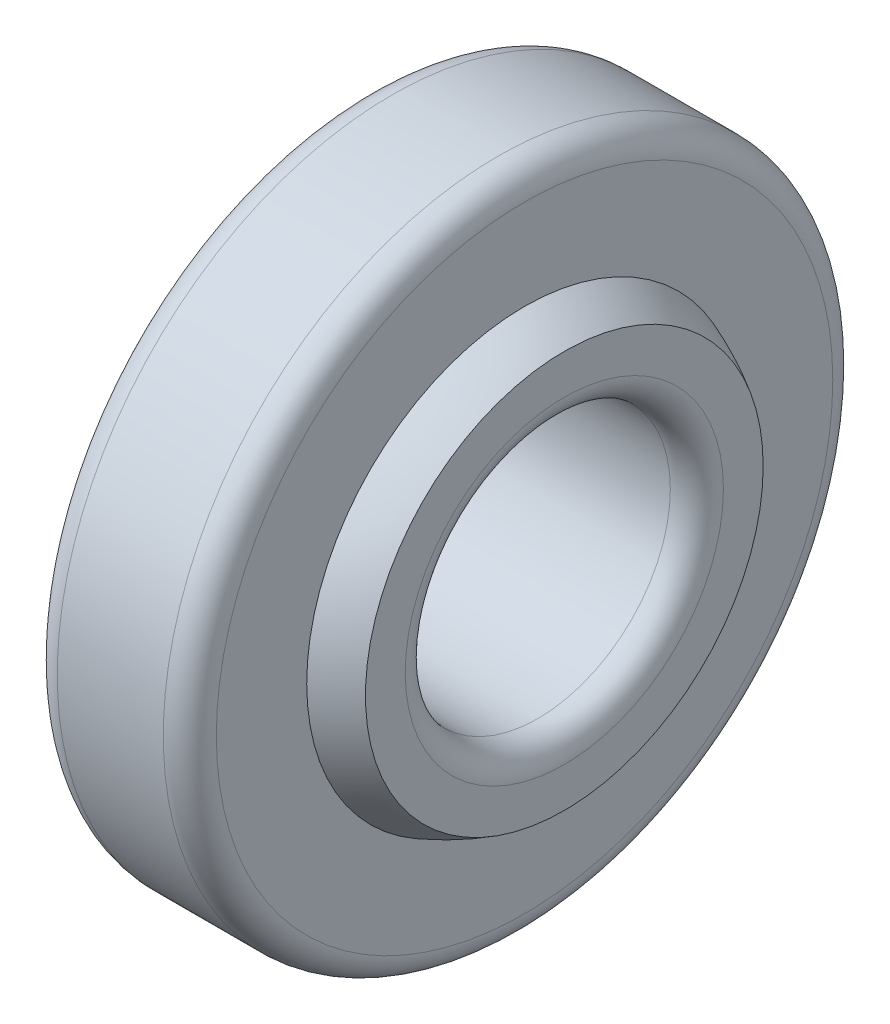
ISO-10303-21;
HEADER;
FILE_DESCRIPTION(('STEP AP214'),'2;1');
FILE_NAME('part.step','',(''),(''),'','','');
FILE_SCHEMA(('AUTOMOTIVE_DESIGN { 1 0 10303 214 1 1 1 1 }'));
ENDSEC;
DATA;
#1=APPLICATION_CONTEXT('core data for automotive mechanical design processes');
#2=APPLICATION_PROTOCOL_DEFINITION('international standard','automotive_design',2000,#1);
#3=PRODUCT_CONTEXT('',#1,'mechanical');
#4=PRODUCT('Part','Part','',(#3));
#5=PRODUCT_RELATED_PRODUCT_CATEGORY('part','',(#4));
#6=PRODUCT_DEFINITION_FORMATION('','',#4);
#7=PRODUCT_DEFINITION_CONTEXT('part definition',#1,'design');
#8=PRODUCT_DEFINITION('design','',#6,#7);
#9=PRODUCT_DEFINITION_SHAPE('','',#8);
#10=(LENGTH_UNIT() NAMED_UNIT(*) SI_UNIT(.MILLI.,.METRE.));
#11=(NAMED_UNIT(*) PLANE_ANGLE_UNIT() SI_UNIT($,.RADIAN.));
#12=(NAMED_UNIT(*) SI_UNIT($,.STERADIAN.) SOLID_ANGLE_UNIT());
#13=UNCERTAINTY_MEASURE_WITH_UNIT(LENGTH_MEASURE(1.E-05),#10,'distance_accuracy_value','');
#14=(GEOMETRIC_REPRESENTATION_CONTEXT(3) GLOBAL_UNCERTAINTY_ASSIGNED_CONTEXT((#13)) GLOBAL_UNIT_ASSIGNED_CONTEXT((#10,
#11,#12)) REPRESENTATION_CONTEXT('',''));
#15=CARTESIAN_POINT('',(0.,0.,0.));
#16=DIRECTION('',(0.,0.,1.));
#17=DIRECTION('',(1.,0.,0.));
#18=AXIS2_PLACEMENT_3D('',#15,#16,#17);
#19=CARTESIAN_POINT('',(0.6,0.,0.));
#20=DIRECTION('',(1.,0.,0.));
#21=DIRECTION('',(0.,0.,-1.));
#22=AXIS2_PLACEMENT_3D('',#19,#20,#21);
#23=PLANE('',#22);
#24=CARTESIAN_POINT('',(0.6,0.,0.));
#25=DIRECTION('',(1.,0.,0.));
#26=DIRECTION('',(0.,0.,-1.));
#27=AXIS2_PLACEMENT_3D('',#24,#25,#26);
#28=CIRCLE('',#27,2.325);
#29=CARTESIAN_POINT('',(0.6,0.,-2.325));
#30=VERTEX_POINT('',#29);
#31=EDGE_CURVE('E10',#30,#30,#28,.T.);
#32=ORIENTED_EDGE('',*,*,#31,.T.);
#33=EDGE_LOOP('',(#32));
#34=FACE_BOUND('',#33,.T.);
#35=CARTESIAN_POINT('',(0.6,0.,0.));
#36=DIRECTION('',(-1.,0.,0.));
#37=DIRECTION('',(0.,0.,1.));
#38=AXIS2_PLACEMENT_3D('',#35,#36,#37);
#39=CIRCLE('',#38,1.6431676725155);
#40=CARTESIAN_POINT('',(0.6,0.,-1.6431676725155));
#41=VERTEX_POINT('',#40);
#42=EDGE_CURVE('E84',#41,#41,#39,.T.);
#43=ORIENTED_EDGE('',*,*,#42,.T.);
#44=EDGE_LOOP('',(#43));
#45=FACE_BOUND('',#44,.T.);
#46=ADVANCED_FACE('F44',(#34,#45),#23,.T.);
#47=CARTESIAN_POINT('',(0.,0.,0.));
#48=DIRECTION('',(-1.,0.,0.));
#49=DIRECTION('',(0.,0.,1.));
#50=AXIS2_PLACEMENT_3D('',#47,#48,#49);
#51=CYLINDRICAL_SURFACE('',#50,2.525);
#52=CARTESIAN_POINT('',(-0.4,0.,0.));
#53=DIRECTION('',(1.,0.,0.));
#54=DIRECTION('',(0.,0.,-1.));
#55=AXIS2_PLACEMENT_3D('',#52,#53,#54);
#56=CIRCLE('',#55,2.525);
#57=CARTESIAN_POINT('',(-0.4,0.,-2.525));
#58=VERTEX_POINT('',#57);
#59=EDGE_CURVE('E52',#58,#58,#56,.T.);
#60=ORIENTED_EDGE('',*,*,#59,.T.);
#61=EDGE_LOOP('',(#60));
#62=FACE_BOUND('',#61,.T.);
#63=CARTESIAN_POINT('',(0.4,0.,0.));
#64=DIRECTION('',(1.,0.,0.));
#65=DIRECTION('',(0.,0.,-1.));
#66=AXIS2_PLACEMENT_3D('',#63,#64,#65);
#67=CIRCLE('',#66,2.525);
#68=CARTESIAN_POINT('',(0.4,0.,-2.525));
#69=VERTEX_POINT('',#68);
#70=EDGE_CURVE('E57',#69,#69,#67,.F.);
#71=ORIENTED_EDGE('',*,*,#70,.T.);
#72=EDGE_LOOP('',(#71));
#73=FACE_BOUND('',#72,.T.);
#74=ADVANCED_FACE('F106',(#62,#73),#51,.T.);
#75=CARTESIAN_POINT('',(-0.6,0.,0.));
#76=DIRECTION('',(1.,0.,0.));
#77=DIRECTION('',(0.,0.,-1.));
#78=AXIS2_PLACEMENT_3D('',#75,#76,#77);
#79=PLANE('',#78);
#80=CARTESIAN_POINT('',(-0.6,0.,0.));
#81=DIRECTION('',(1.,0.,0.));
#82=DIRECTION('',(0.,0.,-1.));
#83=AXIS2_PLACEMENT_3D('',#80,#81,#82);
#84=CIRCLE('',#83,2.325);
#85=CARTESIAN_POINT('',(-0.6,0.,-2.325));
#86=VERTEX_POINT('',#85);
#87=EDGE_CURVE('E62',#86,#86,#84,.F.);
#88=ORIENTED_EDGE('',*,*,#87,.T.);
#89=EDGE_LOOP('',(#88));
#90=FACE_BOUND('',#89,.T.);
#91=CARTESIAN_POINT('',(-0.6,0.,0.));
#92=DIRECTION('',(-1.,0.,0.));
#93=DIRECTION('',(0.,0.,1.));
#94=AXIS2_PLACEMENT_3D('',#91,#92,#93);
#95=CIRCLE('',#94,1.6431676725155);
#96=CARTESIAN_POINT('',(-0.6,0.,-1.6431676725155));
#97=VERTEX_POINT('',#96);
#98=EDGE_CURVE('E89',#97,#97,#95,.T.);
#99=ORIENTED_EDGE('',*,*,#98,.F.);
#100=EDGE_LOOP('',(#99));
#101=FACE_BOUND('',#100,.T.);
#102=ADVANCED_FACE('F103',(#90,#101),#79,.F.);
#103=CARTESIAN_POINT('',(0.,0.,0.));
#104=DIRECTION('',(-1.,0.,0.));
#105=DIRECTION('',(0.,0.,1.));
#106=AXIS2_PLACEMENT_3D('',#103,#104,#105);
#107=CYLINDRICAL_SURFACE('',#106,1.);
#108=CARTESIAN_POINT('',(-0.7,0.,0.));
#109=DIRECTION('',(1.,0.,0.));
#110=DIRECTION('',(0.,0.,-1.));
#111=AXIS2_PLACEMENT_3D('',#108,#109,#110);
#112=CIRCLE('',#111,1.);
#113=CARTESIAN_POINT('',(-0.7,0.,-1.));
#114=VERTEX_POINT('',#113);
#115=EDGE_CURVE('E76',#114,#114,#112,.F.);
#116=ORIENTED_EDGE('',*,*,#115,.T.);
#117=EDGE_LOOP('',(#116));
#118=FACE_BOUND('',#117,.T.);
#119=CARTESIAN_POINT('',(0.7,0.,0.));
#120=DIRECTION('',(1.,0.,0.));
#121=DIRECTION('',(0.,0.,-1.));
#122=AXIS2_PLACEMENT_3D('',#119,#120,#121);
#123=CIRCLE('',#122,1.);
#124=CARTESIAN_POINT('',(0.7,0.,-1.));
#125=VERTEX_POINT('',#124);
#126=EDGE_CURVE('E80',#125,#125,#123,.T.);
#127=ORIENTED_EDGE('',*,*,#126,.T.);
#128=EDGE_LOOP('',(#127));
#129=FACE_BOUND('',#128,.T.);
#130=ADVANCED_FACE('F105',(#118,#129),#107,.F.);
#131=CARTESIAN_POINT('',(-0.9,0.,-1.5));
#132=DIRECTION('',(1.,0.,0.));
#133=DIRECTION('',(0.,0.,-1.));
#134=AXIS2_PLACEMENT_3D('',#131,#132,#133);
#135=PLANE('',#134);
#136=CARTESIAN_POINT('',(-0.9,0.,0.));
#137=DIRECTION('',(1.,0.,0.));
#138=DIRECTION('',(0.,0.,-1.));
#139=AXIS2_PLACEMENT_3D('',#136,#137,#138);
#140=CIRCLE('',#139,1.2);
#141=CARTESIAN_POINT('',(-0.9,0.,-1.2));
#142=VERTEX_POINT('',#141);
#143=EDGE_CURVE('E72',#142,#142,#140,.T.);
#144=ORIENTED_EDGE('',*,*,#143,.T.);
#145=EDGE_LOOP('',(#144));
#146=FACE_BOUND('',#145,.T.);
#147=CARTESIAN_POINT('',(-0.9,0.,0.));
#148=DIRECTION('',(-1.,0.,0.));
#149=DIRECTION('',(0.,0.,1.));
#150=AXIS2_PLACEMENT_3D('',#147,#148,#149);
#151=CIRCLE('',#150,1.5);
#152=CARTESIAN_POINT('',(-0.9,0.,-1.5));
#153=VERTEX_POINT('',#152);
#154=EDGE_CURVE('E90',#153,#153,#151,.T.);
#155=ORIENTED_EDGE('',*,*,#154,.T.);
#156=EDGE_LOOP('',(#155));
#157=FACE_BOUND('',#156,.T.);
#158=ADVANCED_FACE('F114',(#146,#157),#135,.F.);
#159=CARTESIAN_POINT('',(0.,0.,0.));
#160=DIRECTION('',(-1.,0.,0.));
#161=DIRECTION('',(0.,0.,-1.));
#162=AXIS2_PLACEMENT_3D('',#159,#160,#161);
#163=SPHERICAL_SURFACE('',#162,1.74928556845359);
#164=CARTESIAN_POINT('',(-0.9,0.,-1.5));
#165=CARTESIAN_POINT('',(-0.897026348152627,0.,-1.50178419126118));
#166=CARTESIAN_POINT('',(-0.894047390610625,0.,-1.50355953969535));
#167=CARTESIAN_POINT('',(-0.888078969797104,0.,-1.50709248861013));
#168=CARTESIAN_POINT('',(-0.885089506525585,0.,-1.50885008909075));
#169=CARTESIAN_POINT('',(-0.879100179912773,0.,-1.51234747979887));
#170=CARTESIAN_POINT('',(-0.87610031657148,0.,-1.51408727002638));
#171=CARTESIAN_POINT('',(-0.870090295946282,0.,-1.5175489787269));
#172=CARTESIAN_POINT('',(-0.867080138662377,0.,-1.51927089719991));
#173=CARTESIAN_POINT('',(-0.861049636616539,0.,-1.52269680147712));
#174=CARTESIAN_POINT('',(-0.858029291854607,0.,-1.52440078728131));
#175=CARTESIAN_POINT('',(-0.851978521684782,0.,-1.5277907659529));
#176=CARTESIAN_POINT('',(-0.848948096276889,0.,-1.5294767588203));
#177=CARTESIAN_POINT('',(-0.84287727200185,0.,-1.53283069198351));
#178=CARTESIAN_POINT('',(-0.839836873134705,0.,-1.53449863227933));
#179=CARTESIAN_POINT('',(-0.833746209481145,0.,-1.53781640130398));
#180=CARTESIAN_POINT('',(-0.830695944694731,0.,-1.53946623003282));
#181=CARTESIAN_POINT('',(-0.824585657091444,0.,-1.54274771756851));
#182=CARTESIAN_POINT('',(-0.82152563427457,0.,-1.54437937637536));
#183=CARTESIAN_POINT('',(-0.815395938844352,0.,-1.54762446635477));
#184=CARTESIAN_POINT('',(-0.812326266231008,0.,-1.54923789752735));
#185=CARTESIAN_POINT('',(-0.806177379783146,0.,-1.55244647517064));
#186=CARTESIAN_POINT('',(-0.803098165948628,0.,-1.55404162164136));
#187=CARTESIAN_POINT('',(-0.796930305971192,0.,-1.55721357346012));
#188=CARTESIAN_POINT('',(-0.793841659828275,0.,-1.55879037880815));
#189=CARTESIAN_POINT('',(-0.787655044480439,0.,-1.56192559260942));
#190=CARTESIAN_POINT('',(-0.78455707527552,0.,-1.56348400106265));
#191=CARTESIAN_POINT('',(-0.778351923379838,0.,-1.56658236595293));
#192=CARTESIAN_POINT('',(-0.775244740689076,0.,-1.56812232238996));
#193=CARTESIAN_POINT('',(-0.769021271723749,0.,-1.57118372877908));
#194=CARTESIAN_POINT('',(-0.765904985449184,0.,-1.57270517873117));
#195=CARTESIAN_POINT('',(-0.759663419540291,0.,-1.57572951833623));
#196=CARTESIAN_POINT('',(-0.756538139905963,0.,-1.57723240798919));
#197=CARTESIAN_POINT('',(-0.750278697819679,0.,-1.58021957383832));
#198=CARTESIAN_POINT('',(-0.747144535367723,0.,-1.58170385003448));
#199=CARTESIAN_POINT('',(-0.740867438502508,0.,-1.58465373647068));
#200=CARTESIAN_POINT('',(-0.73772450408925,0.,-1.58611934671072));
#201=CARTESIAN_POINT('',(-0.73142997446802,0.,-1.58903184939556));
#202=CARTESIAN_POINT('',(-0.72827837926005,0.,-1.59047874184037));
#203=CARTESIAN_POINT('',(-0.721966639522323,0.,-1.59335375775771));
#204=CARTESIAN_POINT('',(-0.718806494992568,0.,-1.59478188123024));
#205=CARTESIAN_POINT('',(-0.71247776838659,0.,-1.59761930868985));
#206=CARTESIAN_POINT('',(-0.709309186310368,0.,-1.59902861267692));
#207=CARTESIAN_POINT('',(-0.702963696685214,0.,-1.60182835131809));
#208=CARTESIAN_POINT('',(-0.699786789136283,0.,-1.60321878597217));
#209=CARTESIAN_POINT('',(-0.693424760933944,0.,-1.60598073676724));
#210=CARTESIAN_POINT('',(-0.690239640280536,0.,-1.60735225290823));
#211=CARTESIAN_POINT('',(-0.683861298527976,0.,-1.61007631816613));
#212=CARTESIAN_POINT('',(-0.680668077428824,0.,-1.61142886728305));
#213=CARTESIAN_POINT('',(-0.674273647730019,0.,-1.61411495065271));
#214=CARTESIAN_POINT('',(-0.671072439130366,0.,-1.61544848490546));
#215=CARTESIAN_POINT('',(-0.664662147658346,0.,-1.6180964913793));
#216=CARTESIAN_POINT('',(-0.66145306478598,0.,-1.6194109636004));
#217=CARTESIAN_POINT('',(-0.655027138274742,0.,-1.62202079951744));
#218=CARTESIAN_POINT('',(-0.651810294635871,0.,-1.62331616321339));
#219=CARTESIAN_POINT('',(-0.645368960372687,0.,-1.62588773626345));
#220=CARTESIAN_POINT('',(-0.642144469748373,0.,-1.62716394561756));
#221=CARTESIAN_POINT('',(-0.63568795556453,0.,-1.62969716484124));
#222=CARTESIAN_POINT('',(-0.632455932005,0.,-1.63095417471081));
#223=CARTESIAN_POINT('',(-0.625984466272285,0.,-1.63344895051495));
#224=CARTESIAN_POINT('',(-0.6227450240991,0.,-1.63468671644951));
#225=CARTESIAN_POINT('',(-0.616258835704779,0.,-1.63714296056473));
#226=CARTESIAN_POINT('',(-0.613012089483642,0.,-1.63836143874539));
#227=CARTESIAN_POINT('',(-0.6065114078856,0.,-1.64077906439934));
#228=CARTESIAN_POINT('',(-0.603257472508696,0.,-1.64197821187263));
#229=CARTESIAN_POINT('',(-0.6,0.,-1.6431676725155));
#230=B_SPLINE_CURVE_WITH_KNOTS('',3,(#164,#165,#166,#167,#168,#169,#170,#171,#172,#173,#174,
#175,#176,#177,#178,#179,#180,#181,#182,#183,#184,#185,#186,#187,#188,#189,#190,#191,#192,#193,
#194,#195,#196,#197,#198,#199,#200,#201,#202,#203,#204,#205,#206,#207,#208,#209,#210,#211,#212,
#213,#214,#215,#216,#217,#218,#219,#220,#221,#222,#223,#224,#225,#226,#227,#228,#229),
.UNSPECIFIED.,.F.,.F.,(4,2,2,2,2,2,2,2,2,2,2,2,2,2,2,2,2,2,2,2,2,2,2,2,2,2,2,2,2,2,2,2,4),(0.,
0.010403517425553,0.0208070348511058,0.0312105522766588,0.0416140697022116,0.0520175871277646,
0.0624211045533174,0.0728246219788704,0.0832281394044232,0.0936316568299762,0.104035174255529,
0.114438691681082,0.124842209106635,0.135245726532188,0.145649243957741,0.156052761383294,
0.166456278808846,0.176859796234399,0.187263313659952,0.197666831085505,0.208070348511058,
0.218473865936611,0.228877383362164,0.239280900787717,0.24968441821327,0.260087935638822,
0.270491453064375,0.280894970489928,0.291298487915481,0.301702005341034,0.312105522766587,
0.32250904019214,0.332912557617693),.UNSPECIFIED.);
#231=EDGE_CURVE('BSEAM101',#153,#97,#230,.T.);
#232=ORIENTED_EDGE('',*,*,#154,.F.);
#233=ORIENTED_EDGE('',*,*,#98,.T.);
#234=ORIENTED_EDGE('',*,*,#231,.T.);
#235=ORIENTED_EDGE('',*,*,#231,.F.);
#236=EDGE_LOOP('',(#232,#234,#233,#235));
#237=FACE_BOUND('',#236,.T.);
#238=ADVANCED_FACE('F101',(#237),#163,.T.);
#239=CARTESIAN_POINT('',(0.9,0.,-1.5));
#240=DIRECTION('',(1.,0.,0.));
#241=DIRECTION('',(0.,0.,-1.));
#242=AXIS2_PLACEMENT_3D('',#239,#240,#241);
#243=PLANE('',#242);
#244=CARTESIAN_POINT('',(0.9,0.,0.));
#245=DIRECTION('',(1.,0.,0.));
#246=DIRECTION('',(0.,0.,-1.));
#247=AXIS2_PLACEMENT_3D('',#244,#245,#246);
#248=CIRCLE('',#247,1.2);
#249=CARTESIAN_POINT('',(0.9,0.,-1.2));
#250=VERTEX_POINT('',#249);
#251=EDGE_CURVE('E68',#250,#250,#248,.F.);
#252=ORIENTED_EDGE('',*,*,#251,.T.);
#253=EDGE_LOOP('',(#252));
#254=FACE_BOUND('',#253,.T.);
#255=CARTESIAN_POINT('',(0.9,0.,0.));
#256=DIRECTION('',(-1.,0.,0.));
#257=DIRECTION('',(0.,0.,1.));
#258=AXIS2_PLACEMENT_3D('',#255,#256,#257);
#259=CIRCLE('',#258,1.5);
#260=CARTESIAN_POINT('',(0.9,0.,-1.5));
#261=VERTEX_POINT('',#260);
#262=EDGE_CURVE('E85',#261,#261,#259,.T.);
#263=ORIENTED_EDGE('',*,*,#262,.F.);
#264=EDGE_LOOP('',(#263));
#265=FACE_BOUND('',#264,.T.);
#266=ADVANCED_FACE('F124',(#254,#265),#243,.T.);
#267=CARTESIAN_POINT('',(0.6,0.,-1.6431676725155));
#268=CARTESIAN_POINT('',(0.603257472508696,0.,-1.64197821187263));
#269=CARTESIAN_POINT('',(0.6065114078856,0.,-1.64077906439934));
#270=CARTESIAN_POINT('',(0.613012089483641,0.,-1.63836143874539));
#271=CARTESIAN_POINT('',(0.616258835704778,0.,-1.63714296056473));
#272=CARTESIAN_POINT('',(0.6227450240991,0.,-1.63468671644951));
#273=CARTESIAN_POINT('',(0.625984466272285,0.,-1.63344895051495));
#274=CARTESIAN_POINT('',(0.632455932004999,0.,-1.63095417471081));
#275=CARTESIAN_POINT('',(0.635687955564529,0.,-1.62969716484124));
#276=CARTESIAN_POINT('',(0.642144469748373,0.,-1.62716394561756));
#277=CARTESIAN_POINT('',(0.645368960372687,0.,-1.62588773626345));
#278=CARTESIAN_POINT('',(0.651810294635871,0.,-1.62331616321339));
#279=CARTESIAN_POINT('',(0.655027138274742,0.,-1.62202079951744));
#280=CARTESIAN_POINT('',(0.66145306478598,0.,-1.6194109636004));
#281=CARTESIAN_POINT('',(0.664662147658346,0.,-1.6180964913793));
#282=CARTESIAN_POINT('',(0.671072439130366,0.,-1.61544848490546));
#283=CARTESIAN_POINT('',(0.674273647730019,0.,-1.61411495065271));
#284=CARTESIAN_POINT('',(0.680668077428824,0.,-1.61142886728305));
#285=CARTESIAN_POINT('',(0.683861298527976,0.,-1.61007631816613));
#286=CARTESIAN_POINT('',(0.690239640280536,0.,-1.60735225290823));
#287=CARTESIAN_POINT('',(0.693424760933944,0.,-1.60598073676724));
#288=CARTESIAN_POINT('',(0.699786789136283,0.,-1.60321878597217));
#289=CARTESIAN_POINT('',(0.702963696685214,0.,-1.60182835131809));
#290=CARTESIAN_POINT('',(0.709309186310368,0.,-1.59902861267692));
#291=CARTESIAN_POINT('',(0.71247776838659,0.,-1.59761930868985));
#292=CARTESIAN_POINT('',(0.718806494992568,0.,-1.59478188123024));
#293=CARTESIAN_POINT('',(0.721966639522323,0.,-1.59335375775771));
#294=CARTESIAN_POINT('',(0.72827837926005,0.,-1.59047874184037));
#295=CARTESIAN_POINT('',(0.73142997446802,0.,-1.58903184939556));
#296=CARTESIAN_POINT('',(0.73772450408925,0.,-1.58611934671072));
#297=CARTESIAN_POINT('',(0.740867438502509,0.,-1.58465373647068));
#298=CARTESIAN_POINT('',(0.747144535367723,0.,-1.58170385003448));
#299=CARTESIAN_POINT('',(0.750278697819679,0.,-1.58021957383832));
#300=CARTESIAN_POINT('',(0.756538139905963,0.,-1.57723240798919));
#301=CARTESIAN_POINT('',(0.759663419540292,0.,-1.57572951833623));
#302=CARTESIAN_POINT('',(0.765904985449185,0.,-1.57270517873117));
#303=CARTESIAN_POINT('',(0.769021271723749,0.,-1.57118372877908));
#304=CARTESIAN_POINT('',(0.775244740689076,0.,-1.56812232238996));
#305=CARTESIAN_POINT('',(0.778351923379839,0.,-1.56658236595293));
#306=CARTESIAN_POINT('',(0.78455707527552,0.,-1.56348400106265));
#307=CARTESIAN_POINT('',(0.787655044480439,0.,-1.56192559260942));
#308=CARTESIAN_POINT('',(0.793841659828275,0.,-1.55879037880815));
#309=CARTESIAN_POINT('',(0.796930305971193,0.,-1.55721357346012));
#310=CARTESIAN_POINT('',(0.803098165948628,0.,-1.55404162164136));
#311=CARTESIAN_POINT('',(0.806177379783146,0.,-1.55244647517064));
#312=CARTESIAN_POINT('',(0.812326266231009,0.,-1.54923789752735));
#313=CARTESIAN_POINT('',(0.815395938844353,0.,-1.54762446635477));
#314=CARTESIAN_POINT('',(0.82152563427457,0.,-1.54437937637535));
#315=CARTESIAN_POINT('',(0.824585657091444,0.,-1.54274771756851));
#316=CARTESIAN_POINT('',(0.830695944694732,0.,-1.53946623003282));
#317=CARTESIAN_POINT('',(0.833746209481146,0.,-1.53781640130398));
#318=CARTESIAN_POINT('',(0.839836873134705,0.,-1.53449863227933));
#319=CARTESIAN_POINT('',(0.842877272001851,0.,-1.53283069198351));
#320=CARTESIAN_POINT('',(0.84894809627689,0.,-1.5294767588203));
#321=CARTESIAN_POINT('',(0.851978521684782,0.,-1.5277907659529));
#322=CARTESIAN_POINT('',(0.858029291854608,0.,-1.52440078728131));
#323=CARTESIAN_POINT('',(0.86104963661654,0.,-1.52269680147712));
#324=CARTESIAN_POINT('',(0.867080138662377,0.,-1.51927089719991));
#325=CARTESIAN_POINT('',(0.870090295946282,0.,-1.5175489787269));
#326=CARTESIAN_POINT('',(0.87610031657148,0.,-1.51408727002638));
#327=CARTESIAN_POINT('',(0.879100179912774,0.,-1.51234747979887));
#328=CARTESIAN_POINT('',(0.885089506525586,0.,-1.50885008909075));
#329=CARTESIAN_POINT('',(0.888078969797105,0.,-1.50709248861013));
#330=CARTESIAN_POINT('',(0.894047390610625,0.,-1.50355953969535));
#331=CARTESIAN_POINT('',(0.897026348152627,0.,-1.50178419126118));
#332=CARTESIAN_POINT('',(0.9,0.,-1.5));
#333=B_SPLINE_CURVE_WITH_KNOTS('',3,(#267,#268,#269,#270,#271,#272,#273,#274,#275,#276,#277,
#278,#279,#280,#281,#282,#283,#284,#285,#286,#287,#288,#289,#290,#291,#292,#293,#294,#295,#296,
#297,#298,#299,#300,#301,#302,#303,#304,#305,#306,#307,#308,#309,#310,#311,#312,#313,#314,#315,
#316,#317,#318,#319,#320,#321,#322,#323,#324,#325,#326,#327,#328,#329,#330,#331,#332),
.UNSPECIFIED.,.F.,.F.,(4,2,2,2,2,2,2,2,2,2,2,2,2,2,2,2,2,2,2,2,2,2,2,2,2,2,2,2,2,2,2,2,4),(0.,
0.0104035174255529,0.0208070348511058,0.0312105522766587,0.0416140697022117,0.0520175871277646,
0.0624211045533177,0.0728246219788705,0.0832281394044235,0.0936316568299764,0.104035174255529,
0.114438691681082,0.124842209106635,0.135245726532188,0.145649243957741,0.156052761383294,
0.166456278808847,0.1768597962344,0.187263313659953,0.197666831085506,0.208070348511059,
0.218473865936612,0.228877383362165,0.239280900787717,0.24968441821327,0.260087935638823,
0.270491453064376,0.280894970489929,0.291298487915482,0.301702005341035,0.312105522766588,
0.322509040192141,0.332912557617694),.UNSPECIFIED.);
#334=EDGE_CURVE('BSEAM120',#41,#261,#333,.T.);
#335=ORIENTED_EDGE('',*,*,#42,.F.);
#336=ORIENTED_EDGE('',*,*,#262,.T.);
#337=ORIENTED_EDGE('',*,*,#334,.T.);
#338=ORIENTED_EDGE('',*,*,#334,.F.);
#339=EDGE_LOOP('',(#335,#337,#336,#338));
#340=FACE_BOUND('',#339,.T.);
#341=ADVANCED_FACE('F120',(#340),#163,.T.);
#342=CARTESIAN_POINT('',(-0.7,0.,0.));
#343=DIRECTION('',(1.,0.,0.));
#344=DIRECTION('',(0.,0.,-1.));
#345=AXIS2_PLACEMENT_3D('',#342,#343,#344);
#346=TOROIDAL_SURFACE('',#345,1.2,0.2);
#347=ORIENTED_EDGE('',*,*,#143,.F.);
#348=EDGE_LOOP('',(#347));
#349=FACE_BOUND('',#348,.T.);
#350=ORIENTED_EDGE('',*,*,#115,.F.);
#351=EDGE_LOOP('',(#350));
#352=FACE_BOUND('',#351,.T.);
#353=ADVANCED_FACE('F109',(#349,#352),#346,.T.);
#354=CARTESIAN_POINT('',(0.7,0.,0.));
#355=DIRECTION('',(1.,0.,0.));
#356=DIRECTION('',(0.,0.,-1.));
#357=AXIS2_PLACEMENT_3D('',#354,#355,#356);
#358=TOROIDAL_SURFACE('',#357,1.2,0.2);
#359=ORIENTED_EDGE('',*,*,#126,.F.);
#360=EDGE_LOOP('',(#359));
#361=FACE_BOUND('',#360,.T.);
#362=ORIENTED_EDGE('',*,*,#251,.F.);
#363=EDGE_LOOP('',(#362));
#364=FACE_BOUND('',#363,.T.);
#365=ADVANCED_FACE('F119',(#361,#364),#358,.T.);
#366=CARTESIAN_POINT('',(-0.4,0.,0.));
#367=DIRECTION('',(1.,0.,0.));
#368=DIRECTION('',(0.,0.,-1.));
#369=AXIS2_PLACEMENT_3D('',#366,#367,#368);
#370=TOROIDAL_SURFACE('',#369,2.325,0.2);
#371=ORIENTED_EDGE('',*,*,#59,.F.);
#372=EDGE_LOOP('',(#371));
#373=FACE_BOUND('',#372,.T.);
#374=ORIENTED_EDGE('',*,*,#87,.F.);
#375=EDGE_LOOP('',(#374));
#376=FACE_BOUND('',#375,.T.);
#377=ADVANCED_FACE('F200',(#373,#376),#370,.T.);
#378=CARTESIAN_POINT('',(0.4,0.,0.));
#379=DIRECTION('',(1.,0.,0.));
#380=DIRECTION('',(0.,0.,-1.));
#381=AXIS2_PLACEMENT_3D('',#378,#379,#380);
#382=TOROIDAL_SURFACE('',#381,2.325,0.2);
#383=ORIENTED_EDGE('',*,*,#31,.F.);
#384=EDGE_LOOP('',(#383));
#385=FACE_BOUND('',#384,.T.);
#386=ORIENTED_EDGE('',*,*,#70,.F.);
#387=EDGE_LOOP('',(#386));
#388=FACE_BOUND('',#387,.T.);
#389=ADVANCED_FACE('F46',(#385,#388),#382,.T.);
#390=CLOSED_SHELL('',(#46,#74,#102,#130,#158,#238,#266,#341,#353,#365,#377,#389));
#391=MANIFOLD_SOLID_BREP('B2',#390);
#392=ADVANCED_BREP_SHAPE_REPRESENTATION('',(#18,#391),#14);
#393=SHAPE_DEFINITION_REPRESENTATION(#9,#392);
ENDSEC;
END-ISO-10303-21;
